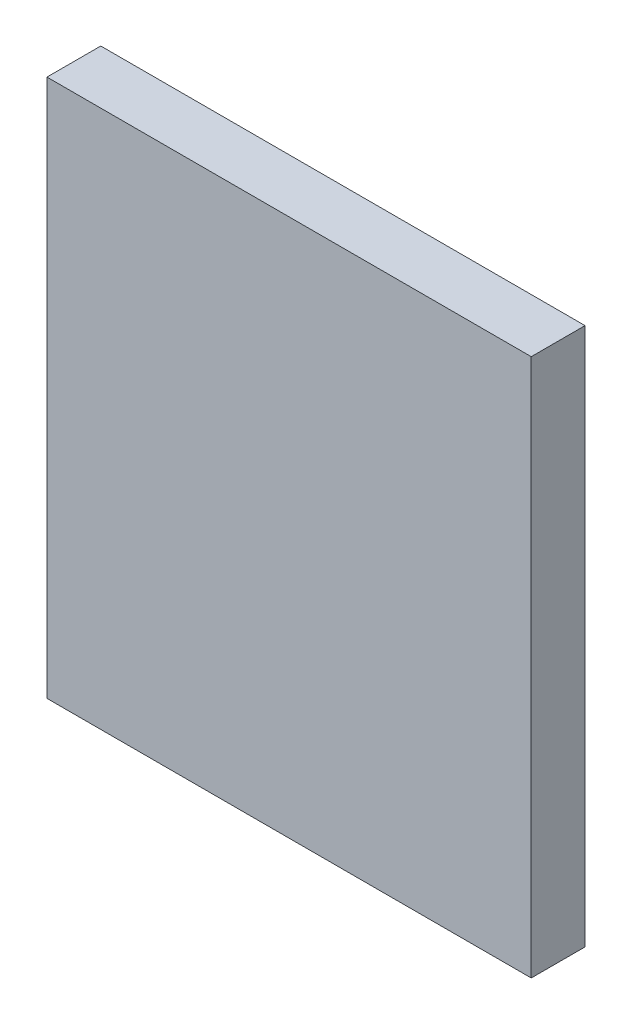
ISO-10303-21;
HEADER;
FILE_DESCRIPTION(('STEP AP214'),'2;1');
FILE_NAME('part.step','',(''),(''),'','','');
FILE_SCHEMA(('AUTOMOTIVE_DESIGN { 1 0 10303 214 1 1 1 1 }'));
ENDSEC;
DATA;
#1=APPLICATION_CONTEXT('core data for automotive mechanical design processes');
#2=APPLICATION_PROTOCOL_DEFINITION('international standard','automotive_design',2000,#1);
#3=PRODUCT_CONTEXT('',#1,'mechanical');
#4=PRODUCT('Part','Part','',(#3));
#5=PRODUCT_RELATED_PRODUCT_CATEGORY('part','',(#4));
#6=PRODUCT_DEFINITION_FORMATION('','',#4);
#7=PRODUCT_DEFINITION_CONTEXT('part definition',#1,'design');
#8=PRODUCT_DEFINITION('design','',#6,#7);
#9=PRODUCT_DEFINITION_SHAPE('','',#8);
#10=(LENGTH_UNIT() NAMED_UNIT(*) SI_UNIT(.MILLI.,.METRE.));
#11=(NAMED_UNIT(*) PLANE_ANGLE_UNIT() SI_UNIT($,.RADIAN.));
#12=(NAMED_UNIT(*) SI_UNIT($,.STERADIAN.) SOLID_ANGLE_UNIT());
#13=UNCERTAINTY_MEASURE_WITH_UNIT(LENGTH_MEASURE(1.E-05),#10,'distance_accuracy_value','');
#14=(GEOMETRIC_REPRESENTATION_CONTEXT(3) GLOBAL_UNCERTAINTY_ASSIGNED_CONTEXT((#13)) GLOBAL_UNIT_ASSIGNED_CONTEXT((#10,
#11,#12)) REPRESENTATION_CONTEXT('',''));
#15=CARTESIAN_POINT('',(0.,0.,0.));
#16=DIRECTION('',(0.,0.,1.));
#17=DIRECTION('',(1.,0.,0.));
#18=AXIS2_PLACEMENT_3D('',#15,#16,#17);
#19=CARTESIAN_POINT('',(0.,0.,-2.));
#20=DIRECTION('',(0.,0.,1.));
#21=DIRECTION('',(1.,0.,0.));
#22=AXIS2_PLACEMENT_3D('',#19,#20,#21);
#23=PLANE('',#22);
#24=DIRECTION('',(0.,1.,0.));
#25=VECTOR('',#24,1.);
#26=CARTESIAN_POINT('',(40.,0.,-2.));
#27=LINE('',#26,#25);
#28=CARTESIAN_POINT('',(40.,-50.,-2.));
#29=VERTEX_POINT('',#28);
#30=CARTESIAN_POINT('',(40.,45.,-2.));
#31=VERTEX_POINT('',#30);
#32=EDGE_CURVE('E390',#29,#31,#27,.T.);
#33=ORIENTED_EDGE('',*,*,#32,.F.);
#34=DIRECTION('',(1.,0.,0.));
#35=VECTOR('',#34,1.);
#36=CARTESIAN_POINT('',(-45.,-50.,-2.));
#37=LINE('',#36,#35);
#38=CARTESIAN_POINT('',(-40.,-50.,-2.));
#39=VERTEX_POINT('',#38);
#40=EDGE_CURVE('E442',#39,#29,#37,.T.);
#41=ORIENTED_EDGE('',*,*,#40,.F.);
#42=DIRECTION('',(0.,-1.,0.));
#43=VECTOR('',#42,1.);
#44=CARTESIAN_POINT('',(-40.,0.,-2.));
#45=LINE('',#44,#43);
#46=CARTESIAN_POINT('',(-40.,45.,-2.));
#47=VERTEX_POINT('',#46);
#48=EDGE_CURVE('E419',#47,#39,#45,.T.);
#49=ORIENTED_EDGE('',*,*,#48,.F.);
#50=DIRECTION('',(-1.,0.,0.));
#51=VECTOR('',#50,1.);
#52=CARTESIAN_POINT('',(0.,45.,-2.));
#53=LINE('',#52,#51);
#54=EDGE_CURVE('E375',#31,#47,#53,.T.);
#55=ORIENTED_EDGE('',*,*,#54,.F.);
#56=EDGE_LOOP('',(#33,#41,#49,#55));
#57=FACE_BOUND('',#56,.T.);
#58=ADVANCED_FACE('F39',(#57),#23,.F.);
#59=CARTESIAN_POINT('',(45.,50.,-2.));
#60=DIRECTION('',(1.,0.,0.));
#61=DIRECTION('',(0.,1.,0.));
#62=AXIS2_PLACEMENT_3D('',#59,#60,#61);
#63=PLANE('',#62);
#64=DIRECTION('',(0.,1.,0.));
#65=VECTOR('',#64,1.);
#66=CARTESIAN_POINT('',(45.,50.,0.));
#67=LINE('',#66,#65);
#68=CARTESIAN_POINT('',(45.,-50.,0.));
#69=VERTEX_POINT('',#68);
#70=CARTESIAN_POINT('',(45.,50.,0.));
#71=VERTEX_POINT('',#70);
#72=EDGE_CURVE('E441',#69,#71,#67,.T.);
#73=ORIENTED_EDGE('',*,*,#72,.F.);
#74=DIRECTION('',(0.,0.,1.));
#75=VECTOR('',#74,1.);
#76=CARTESIAN_POINT('',(45.,-50.,-2.));
#77=LINE('',#76,#75);
#78=CARTESIAN_POINT('',(45.,-50.,-10.));
#79=VERTEX_POINT('',#78);
#80=EDGE_CURVE('E11',#79,#69,#77,.T.);
#81=ORIENTED_EDGE('',*,*,#80,.F.);
#82=DIRECTION('',(0.,-1.,0.));
#83=VECTOR('',#82,1.);
#84=CARTESIAN_POINT('',(45.,0.,-10.));
#85=LINE('',#84,#83);
#86=CARTESIAN_POINT('',(45.,50.,-10.));
#87=VERTEX_POINT('',#86);
#88=EDGE_CURVE('E405',#87,#79,#85,.T.);
#89=ORIENTED_EDGE('',*,*,#88,.F.);
#90=DIRECTION('',(0.,0.,1.));
#91=VECTOR('',#90,1.);
#92=CARTESIAN_POINT('',(45.,50.,-2.));
#93=LINE('',#92,#91);
#94=EDGE_CURVE('E43',#87,#71,#93,.T.);
#95=ORIENTED_EDGE('',*,*,#94,.T.);
#96=EDGE_LOOP('',(#73,#81,#89,#95));
#97=FACE_BOUND('',#96,.T.);
#98=ADVANCED_FACE('F41',(#97),#63,.T.);
#99=CARTESIAN_POINT('',(-45.,-50.,-2.));
#100=DIRECTION('',(0.,-1.,0.));
#101=DIRECTION('',(0.,0.,-1.));
#102=AXIS2_PLACEMENT_3D('',#99,#100,#101);
#103=PLANE('',#102);
#104=DIRECTION('',(1.,0.,0.));
#105=VECTOR('',#104,1.);
#106=CARTESIAN_POINT('',(-45.,-50.,0.));
#107=LINE('',#106,#105);
#108=CARTESIAN_POINT('',(-45.,-50.,0.));
#109=VERTEX_POINT('',#108);
#110=EDGE_CURVE('E446',#109,#69,#107,.T.);
#111=ORIENTED_EDGE('',*,*,#110,.F.);
#112=DIRECTION('',(0.,0.,1.));
#113=VECTOR('',#112,1.);
#114=CARTESIAN_POINT('',(-45.,-50.,-2.));
#115=LINE('',#114,#113);
#116=CARTESIAN_POINT('',(-45.,-50.,-10.));
#117=VERTEX_POINT('',#116);
#118=EDGE_CURVE('E49',#117,#109,#115,.T.);
#119=ORIENTED_EDGE('',*,*,#118,.F.);
#120=DIRECTION('',(-1.,0.,0.));
#121=VECTOR('',#120,1.);
#122=CARTESIAN_POINT('',(0.,-50.,-10.));
#123=LINE('',#122,#121);
#124=CARTESIAN_POINT('',(-40.,-50.,-10.));
#125=VERTEX_POINT('',#124);
#126=EDGE_CURVE('E393',#125,#117,#123,.T.);
#127=ORIENTED_EDGE('',*,*,#126,.F.);
#128=DIRECTION('',(0.,0.,1.));
#129=VECTOR('',#128,1.);
#130=CARTESIAN_POINT('',(-40.,-50.,-10.));
#131=LINE('',#130,#129);
#132=EDGE_CURVE('E433',#125,#39,#131,.T.);
#133=ORIENTED_EDGE('',*,*,#132,.T.);
#134=ORIENTED_EDGE('',*,*,#40,.T.);
#135=DIRECTION('',(0.,0.,1.));
#136=VECTOR('',#135,1.);
#137=CARTESIAN_POINT('',(40.,-50.,-10.));
#138=LINE('',#137,#136);
#139=CARTESIAN_POINT('',(40.,-50.,-10.));
#140=VERTEX_POINT('',#139);
#141=EDGE_CURVE('E429',#140,#29,#138,.T.);
#142=ORIENTED_EDGE('',*,*,#141,.F.);
#143=DIRECTION('',(-1.,0.,0.));
#144=VECTOR('',#143,1.);
#145=CARTESIAN_POINT('',(0.,-50.,-10.));
#146=LINE('',#145,#144);
#147=EDGE_CURVE('E409',#79,#140,#146,.T.);
#148=ORIENTED_EDGE('',*,*,#147,.F.);
#149=ORIENTED_EDGE('',*,*,#80,.T.);
#150=EDGE_LOOP('',(#111,#119,#127,#133,#134,#142,#148,#149));
#151=FACE_BOUND('',#150,.T.);
#152=ADVANCED_FACE('F477',(#151),#103,.T.);
#153=CARTESIAN_POINT('',(-45.,50.,-2.));
#154=DIRECTION('',(-1.,0.,0.));
#155=DIRECTION('',(0.,-1.,0.));
#156=AXIS2_PLACEMENT_3D('',#153,#154,#155);
#157=PLANE('',#156);
#158=DIRECTION('',(0.,-1.,0.));
#159=VECTOR('',#158,1.);
#160=CARTESIAN_POINT('',(-45.,50.,0.));
#161=LINE('',#160,#159);
#162=CARTESIAN_POINT('',(-45.,50.,0.));
#163=VERTEX_POINT('',#162);
#164=EDGE_CURVE('E454',#163,#109,#161,.T.);
#165=ORIENTED_EDGE('',*,*,#164,.F.);
#166=DIRECTION('',(0.,0.,1.));
#167=VECTOR('',#166,1.);
#168=CARTESIAN_POINT('',(-45.,50.,-2.));
#169=LINE('',#168,#167);
#170=CARTESIAN_POINT('',(-45.,50.,-10.));
#171=VERTEX_POINT('',#170);
#172=EDGE_CURVE('E462',#171,#163,#169,.T.);
#173=ORIENTED_EDGE('',*,*,#172,.F.);
#174=DIRECTION('',(0.,1.,0.));
#175=VECTOR('',#174,1.);
#176=CARTESIAN_POINT('',(-45.,0.,-10.));
#177=LINE('',#176,#175);
#178=EDGE_CURVE('E397',#117,#171,#177,.T.);
#179=ORIENTED_EDGE('',*,*,#178,.F.);
#180=ORIENTED_EDGE('',*,*,#118,.T.);
#181=EDGE_LOOP('',(#165,#173,#179,#180));
#182=FACE_BOUND('',#181,.T.);
#183=ADVANCED_FACE('F485',(#182),#157,.T.);
#184=CARTESIAN_POINT('',(-45.,50.,-2.));
#185=DIRECTION('',(0.,1.,0.));
#186=DIRECTION('',(0.,0.,1.));
#187=AXIS2_PLACEMENT_3D('',#184,#185,#186);
#188=PLANE('',#187);
#189=DIRECTION('',(-1.,0.,0.));
#190=VECTOR('',#189,1.);
#191=CARTESIAN_POINT('',(-45.,50.,0.));
#192=LINE('',#191,#190);
#193=EDGE_CURVE('E450',#71,#163,#192,.T.);
#194=ORIENTED_EDGE('',*,*,#193,.F.);
#195=ORIENTED_EDGE('',*,*,#94,.F.);
#196=DIRECTION('',(1.,0.,0.));
#197=VECTOR('',#196,1.);
#198=CARTESIAN_POINT('',(0.,50.,-10.));
#199=LINE('',#198,#197);
#200=EDGE_CURVE('E401',#171,#87,#199,.T.);
#201=ORIENTED_EDGE('',*,*,#200,.F.);
#202=ORIENTED_EDGE('',*,*,#172,.T.);
#203=EDGE_LOOP('',(#194,#195,#201,#202));
#204=FACE_BOUND('',#203,.T.);
#205=ADVANCED_FACE('F472',(#204),#188,.T.);
#206=CARTESIAN_POINT('',(0.,0.,0.));
#207=DIRECTION('',(0.,0.,1.));
#208=DIRECTION('',(1.,0.,0.));
#209=AXIS2_PLACEMENT_3D('',#206,#207,#208);
#210=PLANE('',#209);
#211=ORIENTED_EDGE('',*,*,#72,.T.);
#212=ORIENTED_EDGE('',*,*,#193,.T.);
#213=ORIENTED_EDGE('',*,*,#164,.T.);
#214=ORIENTED_EDGE('',*,*,#110,.T.);
#215=EDGE_LOOP('',(#211,#212,#213,#214));
#216=FACE_BOUND('',#215,.T.);
#217=ADVANCED_FACE('F474',(#216),#210,.T.);
#218=CARTESIAN_POINT('',(0.,45.,-10.));
#219=DIRECTION('',(0.,1.,0.));
#220=DIRECTION('',(0.,0.,1.));
#221=AXIS2_PLACEMENT_3D('',#218,#219,#220);
#222=PLANE('',#221);
#223=ORIENTED_EDGE('',*,*,#54,.T.);
#224=DIRECTION('',(0.,0.,1.));
#225=VECTOR('',#224,1.);
#226=CARTESIAN_POINT('',(-40.,45.,-10.));
#227=LINE('',#226,#225);
#228=CARTESIAN_POINT('',(-40.,45.,-10.));
#229=VERTEX_POINT('',#228);
#230=EDGE_CURVE('E437',#229,#47,#227,.T.);
#231=ORIENTED_EDGE('',*,*,#230,.F.);
#232=DIRECTION('',(-1.,0.,0.));
#233=VECTOR('',#232,1.);
#234=CARTESIAN_POINT('',(0.,45.,-10.));
#235=LINE('',#234,#233);
#236=CARTESIAN_POINT('',(40.,45.,-10.));
#237=VERTEX_POINT('',#236);
#238=EDGE_CURVE('E385',#237,#229,#235,.T.);
#239=ORIENTED_EDGE('',*,*,#238,.F.);
#240=DIRECTION('',(0.,0.,1.));
#241=VECTOR('',#240,1.);
#242=CARTESIAN_POINT('',(40.,45.,-10.));
#243=LINE('',#242,#241);
#244=EDGE_CURVE('E415',#237,#31,#243,.T.);
#245=ORIENTED_EDGE('',*,*,#244,.T.);
#246=EDGE_LOOP('',(#223,#231,#239,#245));
#247=FACE_BOUND('',#246,.T.);
#248=ADVANCED_FACE('F501',(#247),#222,.F.);
#249=CARTESIAN_POINT('',(-40.,0.,-10.));
#250=DIRECTION('',(-1.,0.,0.));
#251=DIRECTION('',(0.,0.,1.));
#252=AXIS2_PLACEMENT_3D('',#249,#250,#251);
#253=PLANE('',#252);
#254=ORIENTED_EDGE('',*,*,#48,.T.);
#255=ORIENTED_EDGE('',*,*,#132,.F.);
#256=DIRECTION('',(0.,-1.,0.));
#257=VECTOR('',#256,1.);
#258=CARTESIAN_POINT('',(-40.,0.,-10.));
#259=LINE('',#258,#257);
#260=EDGE_CURVE('E389',#229,#125,#259,.T.);
#261=ORIENTED_EDGE('',*,*,#260,.F.);
#262=ORIENTED_EDGE('',*,*,#230,.T.);
#263=EDGE_LOOP('',(#254,#255,#261,#262));
#264=FACE_BOUND('',#263,.T.);
#265=ADVANCED_FACE('F507',(#264),#253,.F.);
#266=CARTESIAN_POINT('',(40.,0.,-10.));
#267=DIRECTION('',(1.,0.,0.));
#268=DIRECTION('',(0.,0.,-1.));
#269=AXIS2_PLACEMENT_3D('',#266,#267,#268);
#270=PLANE('',#269);
#271=ORIENTED_EDGE('',*,*,#32,.T.);
#272=ORIENTED_EDGE('',*,*,#244,.F.);
#273=DIRECTION('',(0.,1.,0.));
#274=VECTOR('',#273,1.);
#275=CARTESIAN_POINT('',(40.,0.,-10.));
#276=LINE('',#275,#274);
#277=EDGE_CURVE('E412',#140,#237,#276,.T.);
#278=ORIENTED_EDGE('',*,*,#277,.F.);
#279=ORIENTED_EDGE('',*,*,#141,.T.);
#280=EDGE_LOOP('',(#271,#272,#278,#279));
#281=FACE_BOUND('',#280,.T.);
#282=ADVANCED_FACE('F512',(#281),#270,.F.);
#283=CARTESIAN_POINT('',(0.,0.,-10.));
#284=DIRECTION('',(0.,0.,-1.));
#285=DIRECTION('',(-1.,0.,0.));
#286=AXIS2_PLACEMENT_3D('',#283,#284,#285);
#287=PLANE('',#286);
#288=DIRECTION('',(0.,1.,0.));
#289=VECTOR('',#288,1.);
#290=CARTESIAN_POINT('',(40.5,-45.5,-10.));
#291=LINE('',#290,#289);
#292=CARTESIAN_POINT('',(40.5,-49.5,-10.));
#293=VERTEX_POINT('',#292);
#294=CARTESIAN_POINT('',(40.5,-45.5,-10.));
#295=VERTEX_POINT('',#294);
#296=EDGE_CURVE('E57',#293,#295,#291,.T.);
#297=ORIENTED_EDGE('',*,*,#296,.F.);
#298=DIRECTION('',(-1.,0.,0.));
#299=VECTOR('',#298,1.);
#300=CARTESIAN_POINT('',(40.5,-49.5,-10.));
#301=LINE('',#300,#299);
#302=CARTESIAN_POINT('',(44.5,-49.5,-10.));
#303=VERTEX_POINT('',#302);
#304=EDGE_CURVE('E305',#303,#293,#301,.T.);
#305=ORIENTED_EDGE('',*,*,#304,.F.);
#306=DIRECTION('',(0.,-1.,0.));
#307=VECTOR('',#306,1.);
#308=CARTESIAN_POINT('',(44.5,-49.5,-10.));
#309=LINE('',#308,#307);
#310=CARTESIAN_POINT('',(44.5,-45.5,-10.));
#311=VERTEX_POINT('',#310);
#312=EDGE_CURVE('E324',#311,#303,#309,.T.);
#313=ORIENTED_EDGE('',*,*,#312,.F.);
#314=DIRECTION('',(1.,0.,0.));
#315=VECTOR('',#314,1.);
#316=CARTESIAN_POINT('',(44.5,-45.5,-10.));
#317=LINE('',#316,#315);
#318=EDGE_CURVE('E320',#295,#311,#317,.T.);
#319=ORIENTED_EDGE('',*,*,#318,.F.);
#320=EDGE_LOOP('',(#297,#305,#313,#319));
#321=FACE_BOUND('',#320,.T.);
#322=DIRECTION('',(0.,-1.,0.));
#323=VECTOR('',#322,1.);
#324=CARTESIAN_POINT('',(-40.5,-49.5,-10.));
#325=LINE('',#324,#323);
#326=CARTESIAN_POINT('',(-40.5,-45.5,-10.));
#327=VERTEX_POINT('',#326);
#328=CARTESIAN_POINT('',(-40.5,-49.5,-10.));
#329=VERTEX_POINT('',#328);
#330=EDGE_CURVE('E65',#327,#329,#325,.T.);
#331=ORIENTED_EDGE('',*,*,#330,.F.);
#332=DIRECTION('',(1.,0.,0.));
#333=VECTOR('',#332,1.);
#334=CARTESIAN_POINT('',(-40.5,-45.5,-10.));
#335=LINE('',#334,#333);
#336=CARTESIAN_POINT('',(-44.5,-45.5,-10.));
#337=VERTEX_POINT('',#336);
#338=EDGE_CURVE('E263',#337,#327,#335,.T.);
#339=ORIENTED_EDGE('',*,*,#338,.F.);
#340=DIRECTION('',(0.,1.,0.));
#341=VECTOR('',#340,1.);
#342=CARTESIAN_POINT('',(-44.5,-45.5,-10.));
#343=LINE('',#342,#341);
#344=CARTESIAN_POINT('',(-44.5,-49.5,-10.));
#345=VERTEX_POINT('',#344);
#346=EDGE_CURVE('E283',#345,#337,#343,.T.);
#347=ORIENTED_EDGE('',*,*,#346,.F.);
#348=DIRECTION('',(-1.,0.,0.));
#349=VECTOR('',#348,1.);
#350=CARTESIAN_POINT('',(-44.5,-49.5,-10.));
#351=LINE('',#350,#349);
#352=EDGE_CURVE('E278',#329,#345,#351,.T.);
#353=ORIENTED_EDGE('',*,*,#352,.F.);
#354=EDGE_LOOP('',(#331,#339,#347,#353));
#355=FACE_BOUND('',#354,.T.);
#356=DIRECTION('',(0.,1.,0.));
#357=VECTOR('',#356,1.);
#358=CARTESIAN_POINT('',(-44.5000000000003,49.4999999999995,-10.));
#359=LINE('',#358,#357);
#360=CARTESIAN_POINT('',(-44.5000000000002,45.4999999999995,-10.));
#361=VERTEX_POINT('',#360);
#362=CARTESIAN_POINT('',(-44.5000000000003,49.4999999999995,-10.));
#363=VERTEX_POINT('',#362);
#364=EDGE_CURVE('E209',#361,#363,#359,.T.);
#365=ORIENTED_EDGE('',*,*,#364,.F.);
#366=DIRECTION('',(-1.,0.,0.));
#367=VECTOR('',#366,1.);
#368=CARTESIAN_POINT('',(-44.5000000000002,45.4999999999995,-10.));
#369=LINE('',#368,#367);
#370=CARTESIAN_POINT('',(-40.5000000000002,45.4999999999995,-10.));
#371=VERTEX_POINT('',#370);
#372=EDGE_CURVE('E229',#371,#361,#369,.T.);
#373=ORIENTED_EDGE('',*,*,#372,.F.);
#374=DIRECTION('',(0.,-1.,0.));
#375=VECTOR('',#374,1.);
#376=CARTESIAN_POINT('',(-40.5000000000002,45.4999999999995,-10.));
#377=LINE('',#376,#375);
#378=CARTESIAN_POINT('',(-40.5000000000003,49.4999999999996,-10.));
#379=VERTEX_POINT('',#378);
#380=EDGE_CURVE('E233',#379,#371,#377,.T.);
#381=ORIENTED_EDGE('',*,*,#380,.F.);
#382=DIRECTION('',(1.,0.,0.));
#383=VECTOR('',#382,1.);
#384=CARTESIAN_POINT('',(-40.5000000000003,49.4999999999996,-10.));
#385=LINE('',#384,#383);
#386=EDGE_CURVE('E242',#363,#379,#385,.T.);
#387=ORIENTED_EDGE('',*,*,#386,.F.);
#388=EDGE_LOOP('',(#365,#373,#381,#387));
#389=FACE_BOUND('',#388,.T.);
#390=DIRECTION('',(0.,-1.,0.));
#391=VECTOR('',#390,1.);
#392=CARTESIAN_POINT('',(44.4999999999998,45.5,-10.));
#393=LINE('',#392,#391);
#394=CARTESIAN_POINT('',(44.4999999999997,49.5,-10.));
#395=VERTEX_POINT('',#394);
#396=CARTESIAN_POINT('',(44.4999999999998,45.5,-10.));
#397=VERTEX_POINT('',#396);
#398=EDGE_CURVE('E252',#395,#397,#393,.T.);
#399=ORIENTED_EDGE('',*,*,#398,.F.);
#400=DIRECTION('',(1.,0.,0.));
#401=VECTOR('',#400,1.);
#402=CARTESIAN_POINT('',(44.4999999999997,49.5,-10.));
#403=LINE('',#402,#401);
#404=CARTESIAN_POINT('',(40.4999999999997,49.5,-10.));
#405=VERTEX_POINT('',#404);
#406=EDGE_CURVE('E346',#405,#395,#403,.T.);
#407=ORIENTED_EDGE('',*,*,#406,.F.);
#408=DIRECTION('',(0.,1.,0.));
#409=VECTOR('',#408,1.);
#410=CARTESIAN_POINT('',(40.4999999999997,49.5,-10.));
#411=LINE('',#410,#409);
#412=CARTESIAN_POINT('',(40.4999999999998,45.5,-10.));
#413=VERTEX_POINT('',#412);
#414=EDGE_CURVE('E365',#413,#405,#411,.T.);
#415=ORIENTED_EDGE('',*,*,#414,.F.);
#416=DIRECTION('',(-1.,0.,0.));
#417=VECTOR('',#416,1.);
#418=CARTESIAN_POINT('',(40.4999999999998,45.5,-10.));
#419=LINE('',#418,#417);
#420=EDGE_CURVE('E361',#397,#413,#419,.T.);
#421=ORIENTED_EDGE('',*,*,#420,.F.);
#422=EDGE_LOOP('',(#399,#407,#415,#421));
#423=FACE_BOUND('',#422,.T.);
#424=ORIENTED_EDGE('',*,*,#238,.T.);
#425=ORIENTED_EDGE('',*,*,#260,.T.);
#426=ORIENTED_EDGE('',*,*,#126,.T.);
#427=ORIENTED_EDGE('',*,*,#178,.T.);
#428=ORIENTED_EDGE('',*,*,#200,.T.);
#429=ORIENTED_EDGE('',*,*,#88,.T.);
#430=ORIENTED_EDGE('',*,*,#147,.T.);
#431=ORIENTED_EDGE('',*,*,#277,.T.);
#432=EDGE_LOOP('',(#424,#425,#426,#427,#428,#429,#430,#431));
#433=FACE_BOUND('',#432,.T.);
#434=ADVANCED_FACE('F482',(#321,#355,#389,#423,#433),#287,.T.);
#435=CARTESIAN_POINT('',(44.4999999999998,45.5,-7.));
#436=DIRECTION('',(1.,0.,0.));
#437=DIRECTION('',(0.,1.,0.));
#438=AXIS2_PLACEMENT_3D('',#435,#436,#437);
#439=PLANE('',#438);
#440=ORIENTED_EDGE('',*,*,#398,.T.);
#441=DIRECTION('',(0.,0.,-1.));
#442=VECTOR('',#441,1.);
#443=CARTESIAN_POINT('',(44.4999999999998,45.5,-7.));
#444=LINE('',#443,#442);
#445=CARTESIAN_POINT('',(44.4999999999998,45.5,-7.));
#446=VERTEX_POINT('',#445);
#447=EDGE_CURVE('E358',#446,#397,#444,.T.);
#448=ORIENTED_EDGE('',*,*,#447,.F.);
#449=DIRECTION('',(0.,-1.,0.));
#450=VECTOR('',#449,1.);
#451=CARTESIAN_POINT('',(44.4999999999998,45.5,-7.));
#452=LINE('',#451,#450);
#453=CARTESIAN_POINT('',(44.4999999999997,49.5,-7.));
#454=VERTEX_POINT('',#453);
#455=EDGE_CURVE('E341',#454,#446,#452,.T.);
#456=ORIENTED_EDGE('',*,*,#455,.F.);
#457=DIRECTION('',(0.,0.,-1.));
#458=VECTOR('',#457,1.);
#459=CARTESIAN_POINT('',(44.4999999999997,49.5,-7.));
#460=LINE('',#459,#458);
#461=EDGE_CURVE('E372',#454,#395,#460,.T.);
#462=ORIENTED_EDGE('',*,*,#461,.T.);
#463=EDGE_LOOP('',(#440,#448,#456,#462));
#464=FACE_BOUND('',#463,.T.);
#465=ADVANCED_FACE('F525',(#464),#439,.F.);
#466=CARTESIAN_POINT('',(44.4999999999997,49.5,-7.));
#467=DIRECTION('',(0.,1.,0.));
#468=DIRECTION('',(-1.,0.,0.));
#469=AXIS2_PLACEMENT_3D('',#466,#467,#468);
#470=PLANE('',#469);
#471=ORIENTED_EDGE('',*,*,#406,.T.);
#472=ORIENTED_EDGE('',*,*,#461,.F.);
#473=DIRECTION('',(1.,0.,0.));
#474=VECTOR('',#473,1.);
#475=CARTESIAN_POINT('',(44.4999999999997,49.5,-7.));
#476=LINE('',#475,#474);
#477=CARTESIAN_POINT('',(40.4999999999997,49.5,-7.));
#478=VERTEX_POINT('',#477);
#479=EDGE_CURVE('E354',#478,#454,#476,.T.);
#480=ORIENTED_EDGE('',*,*,#479,.F.);
#481=DIRECTION('',(0.,0.,-1.));
#482=VECTOR('',#481,1.);
#483=CARTESIAN_POINT('',(40.4999999999997,49.5,-7.));
#484=LINE('',#483,#482);
#485=EDGE_CURVE('E376',#478,#405,#484,.T.);
#486=ORIENTED_EDGE('',*,*,#485,.T.);
#487=EDGE_LOOP('',(#471,#472,#480,#486));
#488=FACE_BOUND('',#487,.T.);
#489=ADVANCED_FACE('F531',(#488),#470,.F.);
#490=CARTESIAN_POINT('',(40.4999999999997,49.5,-7.));
#491=DIRECTION('',(-1.,0.,0.));
#492=DIRECTION('',(0.,-1.,0.));
#493=AXIS2_PLACEMENT_3D('',#490,#491,#492);
#494=PLANE('',#493);
#495=ORIENTED_EDGE('',*,*,#414,.T.);
#496=ORIENTED_EDGE('',*,*,#485,.F.);
#497=DIRECTION('',(0.,1.,0.));
#498=VECTOR('',#497,1.);
#499=CARTESIAN_POINT('',(40.4999999999997,49.5,-7.));
#500=LINE('',#499,#498);
#501=CARTESIAN_POINT('',(40.4999999999998,45.5,-7.));
#502=VERTEX_POINT('',#501);
#503=EDGE_CURVE('E350',#502,#478,#500,.T.);
#504=ORIENTED_EDGE('',*,*,#503,.F.);
#505=DIRECTION('',(0.,0.,-1.));
#506=VECTOR('',#505,1.);
#507=CARTESIAN_POINT('',(40.4999999999998,45.5,-7.));
#508=LINE('',#507,#506);
#509=EDGE_CURVE('E379',#502,#413,#508,.T.);
#510=ORIENTED_EDGE('',*,*,#509,.T.);
#511=EDGE_LOOP('',(#495,#496,#504,#510));
#512=FACE_BOUND('',#511,.T.);
#513=ADVANCED_FACE('F537',(#512),#494,.F.);
#514=CARTESIAN_POINT('',(40.4999999999998,45.5,-7.));
#515=DIRECTION('',(0.,-1.,0.));
#516=DIRECTION('',(1.,0.,0.));
#517=AXIS2_PLACEMENT_3D('',#514,#515,#516);
#518=PLANE('',#517);
#519=ORIENTED_EDGE('',*,*,#420,.T.);
#520=ORIENTED_EDGE('',*,*,#509,.F.);
#521=DIRECTION('',(-1.,0.,0.));
#522=VECTOR('',#521,1.);
#523=CARTESIAN_POINT('',(40.4999999999998,45.5,-7.));
#524=LINE('',#523,#522);
#525=EDGE_CURVE('E345',#446,#502,#524,.T.);
#526=ORIENTED_EDGE('',*,*,#525,.F.);
#527=ORIENTED_EDGE('',*,*,#447,.T.);
#528=EDGE_LOOP('',(#519,#520,#526,#527));
#529=FACE_BOUND('',#528,.T.);
#530=ADVANCED_FACE('F533',(#529),#518,.F.);
#531=CARTESIAN_POINT('',(0.,0.,-7.));
#532=DIRECTION('',(0.,0.,1.));
#533=DIRECTION('',(1.,0.,0.));
#534=AXIS2_PLACEMENT_3D('',#531,#532,#533);
#535=PLANE('',#534);
#536=ORIENTED_EDGE('',*,*,#455,.T.);
#537=ORIENTED_EDGE('',*,*,#525,.T.);
#538=ORIENTED_EDGE('',*,*,#503,.T.);
#539=ORIENTED_EDGE('',*,*,#479,.T.);
#540=EDGE_LOOP('',(#536,#537,#538,#539));
#541=FACE_BOUND('',#540,.T.);
#542=ADVANCED_FACE('F536',(#541),#535,.F.);
#543=CARTESIAN_POINT('',(-44.5000000000003,49.4999999999995,-7.));
#544=DIRECTION('',(-1.,0.,0.));
#545=DIRECTION('',(0.,-1.,0.));
#546=AXIS2_PLACEMENT_3D('',#543,#544,#545);
#547=PLANE('',#546);
#548=ORIENTED_EDGE('',*,*,#364,.T.);
#549=DIRECTION('',(0.,0.,-1.));
#550=VECTOR('',#549,1.);
#551=CARTESIAN_POINT('',(-44.5000000000003,49.4999999999995,-7.));
#552=LINE('',#551,#550);
#553=CARTESIAN_POINT('',(-44.5000000000003,49.4999999999995,-7.));
#554=VERTEX_POINT('',#553);
#555=EDGE_CURVE('E202',#554,#363,#552,.T.);
#556=ORIENTED_EDGE('',*,*,#555,.F.);
#557=DIRECTION('',(0.,1.,0.));
#558=VECTOR('',#557,1.);
#559=CARTESIAN_POINT('',(-44.5000000000003,49.4999999999995,-7.));
#560=LINE('',#559,#558);
#561=CARTESIAN_POINT('',(-44.5000000000002,45.4999999999995,-7.));
#562=VERTEX_POINT('',#561);
#563=EDGE_CURVE('E206',#562,#554,#560,.T.);
#564=ORIENTED_EDGE('',*,*,#563,.F.);
#565=DIRECTION('',(0.,0.,-1.));
#566=VECTOR('',#565,1.);
#567=CARTESIAN_POINT('',(-44.5000000000002,45.4999999999995,-7.));
#568=LINE('',#567,#566);
#569=EDGE_CURVE('E249',#562,#361,#568,.T.);
#570=ORIENTED_EDGE('',*,*,#569,.T.);
#571=EDGE_LOOP('',(#548,#556,#564,#570));
#572=FACE_BOUND('',#571,.T.);
#573=ADVANCED_FACE('F204',(#572),#547,.F.);
#574=CARTESIAN_POINT('',(-44.5000000000002,45.4999999999995,-7.));
#575=DIRECTION('',(0.,-1.,0.));
#576=DIRECTION('',(1.,0.,0.));
#577=AXIS2_PLACEMENT_3D('',#574,#575,#576);
#578=PLANE('',#577);
#579=ORIENTED_EDGE('',*,*,#372,.T.);
#580=ORIENTED_EDGE('',*,*,#569,.F.);
#581=DIRECTION('',(-1.,0.,0.));
#582=VECTOR('',#581,1.);
#583=CARTESIAN_POINT('',(-44.5000000000002,45.4999999999995,-7.));
#584=LINE('',#583,#582);
#585=CARTESIAN_POINT('',(-40.5000000000002,45.4999999999995,-7.));
#586=VERTEX_POINT('',#585);
#587=EDGE_CURVE('E215',#586,#562,#584,.T.);
#588=ORIENTED_EDGE('',*,*,#587,.F.);
#589=DIRECTION('',(0.,0.,-1.));
#590=VECTOR('',#589,1.);
#591=CARTESIAN_POINT('',(-40.5000000000002,45.4999999999995,-7.));
#592=LINE('',#591,#590);
#593=EDGE_CURVE('E253',#586,#371,#592,.T.);
#594=ORIENTED_EDGE('',*,*,#593,.T.);
#595=EDGE_LOOP('',(#579,#580,#588,#594));
#596=FACE_BOUND('',#595,.T.);
#597=ADVANCED_FACE('F588',(#596),#578,.F.);
#598=CARTESIAN_POINT('',(-40.5000000000002,45.4999999999995,-7.));
#599=DIRECTION('',(1.,0.,0.));
#600=DIRECTION('',(0.,1.,0.));
#601=AXIS2_PLACEMENT_3D('',#598,#599,#600);
#602=PLANE('',#601);
#603=ORIENTED_EDGE('',*,*,#380,.T.);
#604=ORIENTED_EDGE('',*,*,#593,.F.);
#605=DIRECTION('',(0.,-1.,0.));
#606=VECTOR('',#605,1.);
#607=CARTESIAN_POINT('',(-40.5000000000002,45.4999999999995,-7.));
#608=LINE('',#607,#606);
#609=CARTESIAN_POINT('',(-40.5000000000003,49.4999999999996,-7.));
#610=VERTEX_POINT('',#609);
#611=EDGE_CURVE('E224',#610,#586,#608,.T.);
#612=ORIENTED_EDGE('',*,*,#611,.F.);
#613=DIRECTION('',(0.,0.,-1.));
#614=VECTOR('',#613,1.);
#615=CARTESIAN_POINT('',(-40.5000000000003,49.4999999999996,-7.));
#616=LINE('',#615,#614);
#617=EDGE_CURVE('E214',#610,#379,#616,.T.);
#618=ORIENTED_EDGE('',*,*,#617,.T.);
#619=EDGE_LOOP('',(#603,#604,#612,#618));
#620=FACE_BOUND('',#619,.T.);
#621=ADVANCED_FACE('F591',(#620),#602,.F.);
#622=CARTESIAN_POINT('',(-40.5000000000003,49.4999999999996,-7.));
#623=DIRECTION('',(0.,1.,0.));
#624=DIRECTION('',(-1.,0.,0.));
#625=AXIS2_PLACEMENT_3D('',#622,#623,#624);
#626=PLANE('',#625);
#627=ORIENTED_EDGE('',*,*,#386,.T.);
#628=ORIENTED_EDGE('',*,*,#617,.F.);
#629=DIRECTION('',(1.,0.,0.));
#630=VECTOR('',#629,1.);
#631=CARTESIAN_POINT('',(-40.5000000000003,49.4999999999996,-7.));
#632=LINE('',#631,#630);
#633=EDGE_CURVE('E218',#554,#610,#632,.T.);
#634=ORIENTED_EDGE('',*,*,#633,.F.);
#635=ORIENTED_EDGE('',*,*,#555,.T.);
#636=EDGE_LOOP('',(#627,#628,#634,#635));
#637=FACE_BOUND('',#636,.T.);
#638=ADVANCED_FACE('F219',(#637),#626,.F.);
#639=CARTESIAN_POINT('',(0.,0.,-7.));
#640=DIRECTION('',(0.,0.,1.));
#641=DIRECTION('',(1.,0.,0.));
#642=AXIS2_PLACEMENT_3D('',#639,#640,#641);
#643=PLANE('',#642);
#644=ORIENTED_EDGE('',*,*,#563,.T.);
#645=ORIENTED_EDGE('',*,*,#633,.T.);
#646=ORIENTED_EDGE('',*,*,#611,.T.);
#647=ORIENTED_EDGE('',*,*,#587,.T.);
#648=EDGE_LOOP('',(#644,#645,#646,#647));
#649=FACE_BOUND('',#648,.T.);
#650=ADVANCED_FACE('F226',(#649),#643,.F.);
#651=CARTESIAN_POINT('',(-40.5,-49.5,-7.));
#652=DIRECTION('',(1.,0.,0.));
#653=DIRECTION('',(0.,0.,-1.));
#654=AXIS2_PLACEMENT_3D('',#651,#652,#653);
#655=PLANE('',#654);
#656=ORIENTED_EDGE('',*,*,#330,.T.);
#657=DIRECTION('',(0.,0.,-1.));
#658=VECTOR('',#657,1.);
#659=CARTESIAN_POINT('',(-40.5,-49.5,-7.));
#660=LINE('',#659,#658);
#661=CARTESIAN_POINT('',(-40.5,-49.5,-7.));
#662=VERTEX_POINT('',#661);
#663=EDGE_CURVE('E275',#662,#329,#660,.T.);
#664=ORIENTED_EDGE('',*,*,#663,.F.);
#665=DIRECTION('',(0.,-1.,0.));
#666=VECTOR('',#665,1.);
#667=CARTESIAN_POINT('',(-40.5,-49.5,-7.));
#668=LINE('',#667,#666);
#669=CARTESIAN_POINT('',(-40.5,-45.5,-7.));
#670=VERTEX_POINT('',#669);
#671=EDGE_CURVE('E258',#670,#662,#668,.T.);
#672=ORIENTED_EDGE('',*,*,#671,.F.);
#673=DIRECTION('',(0.,0.,-1.));
#674=VECTOR('',#673,1.);
#675=CARTESIAN_POINT('',(-40.5,-45.5,-7.));
#676=LINE('',#675,#674);
#677=EDGE_CURVE('E243',#670,#327,#676,.T.);
#678=ORIENTED_EDGE('',*,*,#677,.T.);
#679=EDGE_LOOP('',(#656,#664,#672,#678));
#680=FACE_BOUND('',#679,.T.);
#681=ADVANCED_FACE('F568',(#680),#655,.F.);
#682=CARTESIAN_POINT('',(-40.5,-45.5,-7.));
#683=DIRECTION('',(0.,1.,0.));
#684=DIRECTION('',(0.,0.,1.));
#685=AXIS2_PLACEMENT_3D('',#682,#683,#684);
#686=PLANE('',#685);
#687=ORIENTED_EDGE('',*,*,#338,.T.);
#688=ORIENTED_EDGE('',*,*,#677,.F.);
#689=DIRECTION('',(1.,0.,0.));
#690=VECTOR('',#689,1.);
#691=CARTESIAN_POINT('',(-40.5,-45.5,-7.));
#692=LINE('',#691,#690);
#693=CARTESIAN_POINT('',(-44.5,-45.5,-7.));
#694=VERTEX_POINT('',#693);
#695=EDGE_CURVE('E271',#694,#670,#692,.T.);
#696=ORIENTED_EDGE('',*,*,#695,.F.);
#697=DIRECTION('',(0.,0.,-1.));
#698=VECTOR('',#697,1.);
#699=CARTESIAN_POINT('',(-44.5,-45.5,-7.));
#700=LINE('',#699,#698);
#701=EDGE_CURVE('E292',#694,#337,#700,.T.);
#702=ORIENTED_EDGE('',*,*,#701,.T.);
#703=EDGE_LOOP('',(#687,#688,#696,#702));
#704=FACE_BOUND('',#703,.T.);
#705=ADVANCED_FACE('F571',(#704),#686,.F.);
#706=CARTESIAN_POINT('',(-44.5,-45.5,-7.));
#707=DIRECTION('',(-1.,0.,0.));
#708=DIRECTION('',(0.,0.,1.));
#709=AXIS2_PLACEMENT_3D('',#706,#707,#708);
#710=PLANE('',#709);
#711=ORIENTED_EDGE('',*,*,#346,.T.);
#712=ORIENTED_EDGE('',*,*,#701,.F.);
#713=DIRECTION('',(0.,1.,0.));
#714=VECTOR('',#713,1.);
#715=CARTESIAN_POINT('',(-44.5,-45.5,-7.));
#716=LINE('',#715,#714);
#717=CARTESIAN_POINT('',(-44.5,-49.5,-7.));
#718=VERTEX_POINT('',#717);
#719=EDGE_CURVE('E267',#718,#694,#716,.T.);
#720=ORIENTED_EDGE('',*,*,#719,.F.);
#721=DIRECTION('',(0.,0.,-1.));
#722=VECTOR('',#721,1.);
#723=CARTESIAN_POINT('',(-44.5,-49.5,-7.));
#724=LINE('',#723,#722);
#725=EDGE_CURVE('E295',#718,#345,#724,.T.);
#726=ORIENTED_EDGE('',*,*,#725,.T.);
#727=EDGE_LOOP('',(#711,#712,#720,#726));
#728=FACE_BOUND('',#727,.T.);
#729=ADVANCED_FACE('F575',(#728),#710,.F.);
#730=CARTESIAN_POINT('',(-44.5,-49.5,-7.));
#731=DIRECTION('',(0.,-1.,0.));
#732=DIRECTION('',(0.,0.,-1.));
#733=AXIS2_PLACEMENT_3D('',#730,#731,#732);
#734=PLANE('',#733);
#735=ORIENTED_EDGE('',*,*,#352,.T.);
#736=ORIENTED_EDGE('',*,*,#725,.F.);
#737=DIRECTION('',(-1.,0.,0.));
#738=VECTOR('',#737,1.);
#739=CARTESIAN_POINT('',(-44.5,-49.5,-7.));
#740=LINE('',#739,#738);
#741=EDGE_CURVE('E262',#662,#718,#740,.T.);
#742=ORIENTED_EDGE('',*,*,#741,.F.);
#743=ORIENTED_EDGE('',*,*,#663,.T.);
#744=EDGE_LOOP('',(#735,#736,#742,#743));
#745=FACE_BOUND('',#744,.T.);
#746=ADVANCED_FACE('F572',(#745),#734,.F.);
#747=CARTESIAN_POINT('',(0.,0.,-7.));
#748=DIRECTION('',(0.,0.,1.));
#749=DIRECTION('',(1.,0.,0.));
#750=AXIS2_PLACEMENT_3D('',#747,#748,#749);
#751=PLANE('',#750);
#752=ORIENTED_EDGE('',*,*,#671,.T.);
#753=ORIENTED_EDGE('',*,*,#741,.T.);
#754=ORIENTED_EDGE('',*,*,#719,.T.);
#755=ORIENTED_EDGE('',*,*,#695,.T.);
#756=EDGE_LOOP('',(#752,#753,#754,#755));
#757=FACE_BOUND('',#756,.T.);
#758=ADVANCED_FACE('F552',(#757),#751,.F.);
#759=CARTESIAN_POINT('',(40.5,-45.5,-7.));
#760=DIRECTION('',(-1.,0.,0.));
#761=DIRECTION('',(0.,0.,1.));
#762=AXIS2_PLACEMENT_3D('',#759,#760,#761);
#763=PLANE('',#762);
#764=ORIENTED_EDGE('',*,*,#296,.T.);
#765=DIRECTION('',(0.,0.,-1.));
#766=VECTOR('',#765,1.);
#767=CARTESIAN_POINT('',(40.5,-45.5,-7.));
#768=LINE('',#767,#766);
#769=CARTESIAN_POINT('',(40.5,-45.5,-7.));
#770=VERTEX_POINT('',#769);
#771=EDGE_CURVE('E317',#770,#295,#768,.T.);
#772=ORIENTED_EDGE('',*,*,#771,.F.);
#773=DIRECTION('',(0.,1.,0.));
#774=VECTOR('',#773,1.);
#775=CARTESIAN_POINT('',(40.5,-45.5,-7.));
#776=LINE('',#775,#774);
#777=CARTESIAN_POINT('',(40.5,-49.5,-7.));
#778=VERTEX_POINT('',#777);
#779=EDGE_CURVE('E300',#778,#770,#776,.T.);
#780=ORIENTED_EDGE('',*,*,#779,.F.);
#781=DIRECTION('',(0.,0.,-1.));
#782=VECTOR('',#781,1.);
#783=CARTESIAN_POINT('',(40.5,-49.5,-7.));
#784=LINE('',#783,#782);
#785=EDGE_CURVE('E279',#778,#293,#784,.T.);
#786=ORIENTED_EDGE('',*,*,#785,.T.);
#787=EDGE_LOOP('',(#764,#772,#780,#786));
#788=FACE_BOUND('',#787,.T.);
#789=ADVANCED_FACE('F548',(#788),#763,.F.);
#790=CARTESIAN_POINT('',(40.5,-49.5,-7.));
#791=DIRECTION('',(0.,-1.,0.));
#792=DIRECTION('',(0.,0.,-1.));
#793=AXIS2_PLACEMENT_3D('',#790,#791,#792);
#794=PLANE('',#793);
#795=ORIENTED_EDGE('',*,*,#304,.T.);
#796=ORIENTED_EDGE('',*,*,#785,.F.);
#797=DIRECTION('',(-1.,0.,0.));
#798=VECTOR('',#797,1.);
#799=CARTESIAN_POINT('',(40.5,-49.5,-7.));
#800=LINE('',#799,#798);
#801=CARTESIAN_POINT('',(44.5,-49.5,-7.));
#802=VERTEX_POINT('',#801);
#803=EDGE_CURVE('E313',#802,#778,#800,.T.);
#804=ORIENTED_EDGE('',*,*,#803,.F.);
#805=DIRECTION('',(0.,0.,-1.));
#806=VECTOR('',#805,1.);
#807=CARTESIAN_POINT('',(44.5,-49.5,-7.));
#808=LINE('',#807,#806);
#809=EDGE_CURVE('E333',#802,#303,#808,.T.);
#810=ORIENTED_EDGE('',*,*,#809,.T.);
#811=EDGE_LOOP('',(#795,#796,#804,#810));
#812=FACE_BOUND('',#811,.T.);
#813=ADVANCED_FACE('F551',(#812),#794,.F.);
#814=CARTESIAN_POINT('',(44.5,-49.5,-7.));
#815=DIRECTION('',(1.,0.,0.));
#816=DIRECTION('',(0.,0.,-1.));
#817=AXIS2_PLACEMENT_3D('',#814,#815,#816);
#818=PLANE('',#817);
#819=ORIENTED_EDGE('',*,*,#312,.T.);
#820=ORIENTED_EDGE('',*,*,#809,.F.);
#821=DIRECTION('',(0.,-1.,0.));
#822=VECTOR('',#821,1.);
#823=CARTESIAN_POINT('',(44.5,-49.5,-7.));
#824=LINE('',#823,#822);
#825=CARTESIAN_POINT('',(44.5,-45.5,-7.));
#826=VERTEX_POINT('',#825);
#827=EDGE_CURVE('E309',#826,#802,#824,.T.);
#828=ORIENTED_EDGE('',*,*,#827,.F.);
#829=DIRECTION('',(0.,0.,-1.));
#830=VECTOR('',#829,1.);
#831=CARTESIAN_POINT('',(44.5,-45.5,-7.));
#832=LINE('',#831,#830);
#833=EDGE_CURVE('E336',#826,#311,#832,.T.);
#834=ORIENTED_EDGE('',*,*,#833,.T.);
#835=EDGE_LOOP('',(#819,#820,#828,#834));
#836=FACE_BOUND('',#835,.T.);
#837=ADVANCED_FACE('F557',(#836),#818,.F.);
#838=CARTESIAN_POINT('',(44.5,-45.5,-7.));
#839=DIRECTION('',(0.,1.,0.));
#840=DIRECTION('',(0.,0.,1.));
#841=AXIS2_PLACEMENT_3D('',#838,#839,#840);
#842=PLANE('',#841);
#843=ORIENTED_EDGE('',*,*,#318,.T.);
#844=ORIENTED_EDGE('',*,*,#833,.F.);
#845=DIRECTION('',(1.,0.,0.));
#846=VECTOR('',#845,1.);
#847=CARTESIAN_POINT('',(44.5,-45.5,-7.));
#848=LINE('',#847,#846);
#849=EDGE_CURVE('E304',#770,#826,#848,.T.);
#850=ORIENTED_EDGE('',*,*,#849,.F.);
#851=ORIENTED_EDGE('',*,*,#771,.T.);
#852=EDGE_LOOP('',(#843,#844,#850,#851));
#853=FACE_BOUND('',#852,.T.);
#854=ADVANCED_FACE('F553',(#853),#842,.F.);
#855=CARTESIAN_POINT('',(0.,0.,-7.));
#856=DIRECTION('',(0.,0.,1.));
#857=DIRECTION('',(1.,0.,0.));
#858=AXIS2_PLACEMENT_3D('',#855,#856,#857);
#859=PLANE('',#858);
#860=ORIENTED_EDGE('',*,*,#779,.T.);
#861=ORIENTED_EDGE('',*,*,#849,.T.);
#862=ORIENTED_EDGE('',*,*,#827,.T.);
#863=ORIENTED_EDGE('',*,*,#803,.T.);
#864=EDGE_LOOP('',(#860,#861,#862,#863));
#865=FACE_BOUND('',#864,.T.);
#866=ADVANCED_FACE('F556',(#865),#859,.F.);
#867=CLOSED_SHELL('',(#58,#98,#152,#183,#205,#217,#248,#265,#282,#434,#465,#489,#513,#530,#542,
#573,#597,#621,#638,#650,#681,#705,#729,#746,#758,#789,#813,#837,#854,#866));
#868=MANIFOLD_SOLID_BREP('B2',#867);
#869=ADVANCED_BREP_SHAPE_REPRESENTATION('',(#18,#868),#14);
#870=SHAPE_DEFINITION_REPRESENTATION(#9,#869);
ENDSEC;
END-ISO-10303-21;
